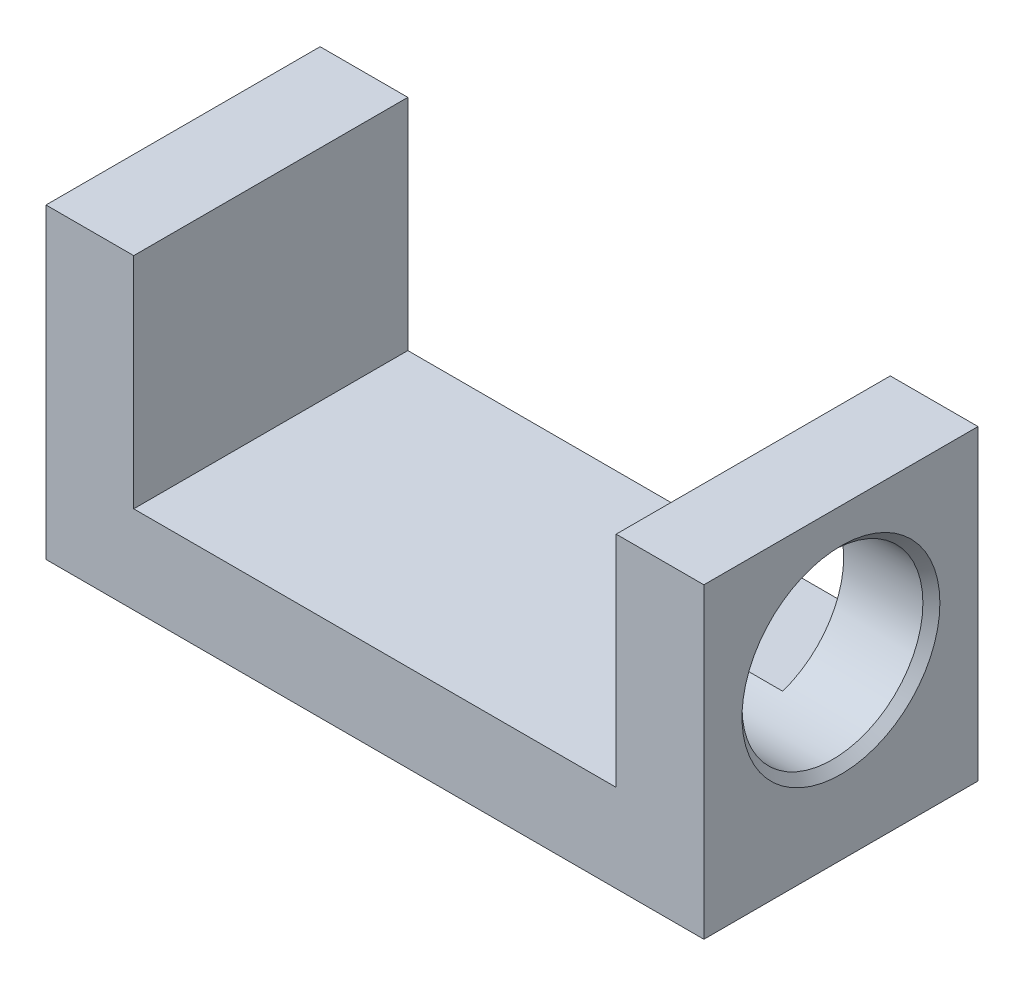
ISO-10303-21;
HEADER;
FILE_DESCRIPTION(('STEP AP214'),'2;1');
FILE_NAME('part.step','',(''),(''),'','','');
FILE_SCHEMA(('AUTOMOTIVE_DESIGN { 1 0 10303 214 1 1 1 1 }'));
ENDSEC;
DATA;
#1=APPLICATION_CONTEXT('core data for automotive mechanical design processes');
#2=APPLICATION_PROTOCOL_DEFINITION('international standard','automotive_design',2000,#1);
#3=PRODUCT_CONTEXT('',#1,'mechanical');
#4=PRODUCT('Part','Part','',(#3));
#5=PRODUCT_RELATED_PRODUCT_CATEGORY('part','',(#4));
#6=PRODUCT_DEFINITION_FORMATION('','',#4);
#7=PRODUCT_DEFINITION_CONTEXT('part definition',#1,'design');
#8=PRODUCT_DEFINITION('design','',#6,#7);
#9=PRODUCT_DEFINITION_SHAPE('','',#8);
#10=(LENGTH_UNIT() NAMED_UNIT(*) SI_UNIT(.MILLI.,.METRE.));
#11=(NAMED_UNIT(*) PLANE_ANGLE_UNIT() SI_UNIT($,.RADIAN.));
#12=(NAMED_UNIT(*) SI_UNIT($,.STERADIAN.) SOLID_ANGLE_UNIT());
#13=UNCERTAINTY_MEASURE_WITH_UNIT(LENGTH_MEASURE(1.E-05),#10,'distance_accuracy_value','');
#14=(GEOMETRIC_REPRESENTATION_CONTEXT(3) GLOBAL_UNCERTAINTY_ASSIGNED_CONTEXT((#13)) GLOBAL_UNIT_ASSIGNED_CONTEXT((#10,
#11,#12)) REPRESENTATION_CONTEXT('',''));
#15=CARTESIAN_POINT('',(0.,0.,0.));
#16=DIRECTION('',(0.,0.,1.));
#17=DIRECTION('',(1.,0.,0.));
#18=AXIS2_PLACEMENT_3D('',#15,#16,#17);
#19=CARTESIAN_POINT('',(-60.,12.2,12.5));
#20=DIRECTION('',(0.,-1.,0.));
#21=DIRECTION('',(0.,0.,-1.));
#22=AXIS2_PLACEMENT_3D('',#19,#20,#21);
#23=PLANE('',#22);
#24=DIRECTION('',(-1.,0.,0.));
#25=VECTOR('',#24,1.);
#26=CARTESIAN_POINT('',(-60.,12.2,12.5));
#27=LINE('',#26,#25);
#28=CARTESIAN_POINT('',(-52.,12.2,12.5));
#29=VERTEX_POINT('',#28);
#30=CARTESIAN_POINT('',(-60.,12.2,12.5));
#31=VERTEX_POINT('',#30);
#32=EDGE_CURVE('E180',#29,#31,#27,.T.);
#33=ORIENTED_EDGE('',*,*,#32,.F.);
#34=DIRECTION('',(0.,0.,1.));
#35=VECTOR('',#34,1.);
#36=CARTESIAN_POINT('',(-52.,12.2,-12.5));
#37=LINE('',#36,#35);
#38=CARTESIAN_POINT('',(-52.,12.2,-12.5));
#39=VERTEX_POINT('',#38);
#40=EDGE_CURVE('E181',#39,#29,#37,.T.);
#41=ORIENTED_EDGE('',*,*,#40,.F.);
#42=DIRECTION('',(-1.,0.,0.));
#43=VECTOR('',#42,1.);
#44=CARTESIAN_POINT('',(-60.,12.2,-12.5));
#45=LINE('',#44,#43);
#46=CARTESIAN_POINT('',(-60.,12.2,-12.5));
#47=VERTEX_POINT('',#46);
#48=EDGE_CURVE('E203',#39,#47,#45,.T.);
#49=ORIENTED_EDGE('',*,*,#48,.T.);
#50=DIRECTION('',(0.,0.,-1.));
#51=VECTOR('',#50,1.);
#52=CARTESIAN_POINT('',(-60.,12.2,12.5));
#53=LINE('',#52,#51);
#54=EDGE_CURVE('E184',#31,#47,#53,.T.);
#55=ORIENTED_EDGE('',*,*,#54,.F.);
#56=EDGE_LOOP('',(#33,#41,#49,#55));
#57=FACE_BOUND('',#56,.T.);
#58=ADVANCED_FACE('F41',(#57),#23,.F.);
#59=CARTESIAN_POINT('',(-60.,12.2,12.5));
#60=DIRECTION('',(1.,0.,0.));
#61=DIRECTION('',(0.,1.,0.));
#62=AXIS2_PLACEMENT_3D('',#59,#60,#61);
#63=PLANE('',#62);
#64=DIRECTION('',(0.,-1.,0.));
#65=VECTOR('',#64,1.);
#66=CARTESIAN_POINT('',(-60.,12.2,-12.5));
#67=LINE('',#66,#65);
#68=CARTESIAN_POINT('',(-60.,-15.8,-12.5));
#69=VERTEX_POINT('',#68);
#70=EDGE_CURVE('E196',#47,#69,#67,.T.);
#71=ORIENTED_EDGE('',*,*,#70,.T.);
#72=DIRECTION('',(0.,0.,-1.));
#73=VECTOR('',#72,1.);
#74=CARTESIAN_POINT('',(-60.,-15.8,12.5));
#75=LINE('',#74,#73);
#76=CARTESIAN_POINT('',(-60.,-15.8,12.5));
#77=VERTEX_POINT('',#76);
#78=EDGE_CURVE('E121',#77,#69,#75,.T.);
#79=ORIENTED_EDGE('',*,*,#78,.F.);
#80=DIRECTION('',(0.,-1.,0.));
#81=VECTOR('',#80,1.);
#82=CARTESIAN_POINT('',(-60.,12.2,12.5));
#83=LINE('',#82,#81);
#84=EDGE_CURVE('E207',#31,#77,#83,.T.);
#85=ORIENTED_EDGE('',*,*,#84,.F.);
#86=ORIENTED_EDGE('',*,*,#54,.T.);
#87=EDGE_LOOP('',(#71,#79,#85,#86));
#88=FACE_BOUND('',#87,.T.);
#89=ADVANCED_FACE('F43',(#88),#63,.F.);
#90=CARTESIAN_POINT('',(-60.,-15.8,12.5));
#91=DIRECTION('',(0.,1.,0.));
#92=DIRECTION('',(0.,0.,1.));
#93=AXIS2_PLACEMENT_3D('',#90,#91,#92);
#94=PLANE('',#93);
#95=DIRECTION('',(1.,0.,0.));
#96=VECTOR('',#95,1.);
#97=CARTESIAN_POINT('',(-60.,-15.8,-12.5));
#98=LINE('',#97,#96);
#99=CARTESIAN_POINT('',(0.,-15.8,-12.5));
#100=VERTEX_POINT('',#99);
#101=EDGE_CURVE('E199',#69,#100,#98,.T.);
#102=ORIENTED_EDGE('',*,*,#101,.T.);
#103=DIRECTION('',(0.,0.,-1.));
#104=VECTOR('',#103,1.);
#105=CARTESIAN_POINT('',(0.,-15.8,12.5));
#106=LINE('',#105,#104);
#107=CARTESIAN_POINT('',(0.,-15.8,12.5));
#108=VERTEX_POINT('',#107);
#109=EDGE_CURVE('E211',#108,#100,#106,.T.);
#110=ORIENTED_EDGE('',*,*,#109,.F.);
#111=DIRECTION('',(1.,0.,0.));
#112=VECTOR('',#111,1.);
#113=CARTESIAN_POINT('',(-60.,-15.8,12.5));
#114=LINE('',#113,#112);
#115=EDGE_CURVE('E192',#77,#108,#114,.T.);
#116=ORIENTED_EDGE('',*,*,#115,.F.);
#117=ORIENTED_EDGE('',*,*,#78,.T.);
#118=EDGE_LOOP('',(#102,#110,#116,#117));
#119=FACE_BOUND('',#118,.T.);
#120=ADVANCED_FACE('F165',(#119),#94,.F.);
#121=CARTESIAN_POINT('',(0.,12.2,12.5));
#122=DIRECTION('',(-1.,0.,0.));
#123=DIRECTION('',(0.,0.,1.));
#124=AXIS2_PLACEMENT_3D('',#121,#122,#123);
#125=PLANE('',#124);
#126=CARTESIAN_POINT('',(0.,0.,0.));
#127=DIRECTION('',(1.,0.,0.));
#128=DIRECTION('',(0.,0.,-1.));
#129=AXIS2_PLACEMENT_3D('',#126,#127,#128);
#130=CIRCLE('',#129,9.025);
#131=CARTESIAN_POINT('',(0.,0.,-9.025));
#132=VERTEX_POINT('',#131);
#133=EDGE_CURVE('E252',#132,#132,#130,.T.);
#134=ORIENTED_EDGE('',*,*,#133,.F.);
#135=EDGE_LOOP('',(#134));
#136=FACE_BOUND('',#135,.T.);
#137=DIRECTION('',(0.,1.,0.));
#138=VECTOR('',#137,1.);
#139=CARTESIAN_POINT('',(0.,12.2,-12.5));
#140=LINE('',#139,#138);
#141=CARTESIAN_POINT('',(0.,12.2,-12.5));
#142=VERTEX_POINT('',#141);
#143=EDGE_CURVE('E201',#100,#142,#140,.T.);
#144=ORIENTED_EDGE('',*,*,#143,.T.);
#145=DIRECTION('',(0.,0.,-1.));
#146=VECTOR('',#145,1.);
#147=CARTESIAN_POINT('',(0.,12.2,12.5));
#148=LINE('',#147,#146);
#149=CARTESIAN_POINT('',(0.,12.2,12.5));
#150=VERTEX_POINT('',#149);
#151=EDGE_CURVE('E209',#150,#142,#148,.T.);
#152=ORIENTED_EDGE('',*,*,#151,.F.);
#153=DIRECTION('',(0.,1.,0.));
#154=VECTOR('',#153,1.);
#155=CARTESIAN_POINT('',(0.,12.2,12.5));
#156=LINE('',#155,#154);
#157=EDGE_CURVE('E189',#108,#150,#156,.T.);
#158=ORIENTED_EDGE('',*,*,#157,.F.);
#159=ORIENTED_EDGE('',*,*,#109,.T.);
#160=EDGE_LOOP('',(#144,#152,#158,#159));
#161=FACE_BOUND('',#160,.T.);
#162=ADVANCED_FACE('F162',(#136,#161),#125,.F.);
#163=CARTESIAN_POINT('',(-8.,12.2,-12.5));
#164=VERTEX_POINT('',#163);
#165=EDGE_CURVE('E204',#142,#164,#45,.T.);
#166=ORIENTED_EDGE('',*,*,#165,.T.);
#167=DIRECTION('',(0.,0.,1.));
#168=VECTOR('',#167,1.);
#169=CARTESIAN_POINT('',(-8.,12.2,-12.5));
#170=LINE('',#169,#168);
#171=CARTESIAN_POINT('',(-8.,12.2,12.5));
#172=VERTEX_POINT('',#171);
#173=EDGE_CURVE('E225',#164,#172,#170,.T.);
#174=ORIENTED_EDGE('',*,*,#173,.T.);
#175=EDGE_CURVE('E188',#150,#172,#27,.T.);
#176=ORIENTED_EDGE('',*,*,#175,.F.);
#177=ORIENTED_EDGE('',*,*,#151,.T.);
#178=EDGE_LOOP('',(#166,#174,#176,#177));
#179=FACE_BOUND('',#178,.T.);
#180=ADVANCED_FACE('F155',(#179),#23,.F.);
#181=CARTESIAN_POINT('',(0.,0.,12.5));
#182=DIRECTION('',(0.,0.,1.));
#183=DIRECTION('',(1.,0.,0.));
#184=AXIS2_PLACEMENT_3D('',#181,#182,#183);
#185=PLANE('',#184);
#186=DIRECTION('',(0.,-1.,0.));
#187=VECTOR('',#186,1.);
#188=CARTESIAN_POINT('',(-52.,12.2,12.5));
#189=LINE('',#188,#187);
#190=CARTESIAN_POINT('',(-52.,-7.80000000000001,12.5));
#191=VERTEX_POINT('',#190);
#192=EDGE_CURVE('E246',#29,#191,#189,.T.);
#193=ORIENTED_EDGE('',*,*,#192,.F.);
#194=ORIENTED_EDGE('',*,*,#32,.T.);
#195=ORIENTED_EDGE('',*,*,#84,.T.);
#196=ORIENTED_EDGE('',*,*,#115,.T.);
#197=ORIENTED_EDGE('',*,*,#157,.T.);
#198=ORIENTED_EDGE('',*,*,#175,.T.);
#199=DIRECTION('',(0.,1.,0.));
#200=VECTOR('',#199,1.);
#201=CARTESIAN_POINT('',(-8.,-7.80000000000001,12.5));
#202=LINE('',#201,#200);
#203=CARTESIAN_POINT('',(-8.,-7.80000000000001,12.5));
#204=VERTEX_POINT('',#203);
#205=EDGE_CURVE('E228',#204,#172,#202,.T.);
#206=ORIENTED_EDGE('',*,*,#205,.F.);
#207=DIRECTION('',(1.,0.,0.));
#208=VECTOR('',#207,1.);
#209=CARTESIAN_POINT('',(-52.,-7.80000000000001,12.5));
#210=LINE('',#209,#208);
#211=EDGE_CURVE('E244',#191,#204,#210,.T.);
#212=ORIENTED_EDGE('',*,*,#211,.F.);
#213=EDGE_LOOP('',(#193,#194,#195,#196,#197,#198,#206,#212));
#214=FACE_BOUND('',#213,.T.);
#215=ADVANCED_FACE('F152',(#214),#185,.T.);
#216=CARTESIAN_POINT('',(0.,0.,-12.5));
#217=DIRECTION('',(0.,0.,1.));
#218=DIRECTION('',(1.,0.,0.));
#219=AXIS2_PLACEMENT_3D('',#216,#217,#218);
#220=PLANE('',#219);
#221=ORIENTED_EDGE('',*,*,#48,.F.);
#222=DIRECTION('',(0.,-1.,0.));
#223=VECTOR('',#222,1.);
#224=CARTESIAN_POINT('',(-52.,12.2,-12.5));
#225=LINE('',#224,#223);
#226=CARTESIAN_POINT('',(-52.,-7.80000000000001,-12.5));
#227=VERTEX_POINT('',#226);
#228=EDGE_CURVE('E241',#39,#227,#225,.T.);
#229=ORIENTED_EDGE('',*,*,#228,.T.);
#230=DIRECTION('',(1.,0.,0.));
#231=VECTOR('',#230,1.);
#232=CARTESIAN_POINT('',(-52.,-7.80000000000001,-12.5));
#233=LINE('',#232,#231);
#234=CARTESIAN_POINT('',(-8.,-7.80000000000001,-12.5));
#235=VERTEX_POINT('',#234);
#236=EDGE_CURVE('E238',#227,#235,#233,.T.);
#237=ORIENTED_EDGE('',*,*,#236,.T.);
#238=DIRECTION('',(0.,1.,0.));
#239=VECTOR('',#238,1.);
#240=CARTESIAN_POINT('',(-8.,-7.80000000000001,-12.5));
#241=LINE('',#240,#239);
#242=EDGE_CURVE('E63',#235,#164,#241,.T.);
#243=ORIENTED_EDGE('',*,*,#242,.T.);
#244=ORIENTED_EDGE('',*,*,#165,.F.);
#245=ORIENTED_EDGE('',*,*,#143,.F.);
#246=ORIENTED_EDGE('',*,*,#101,.F.);
#247=ORIENTED_EDGE('',*,*,#70,.F.);
#248=EDGE_LOOP('',(#221,#229,#237,#243,#244,#245,#246,#247));
#249=FACE_BOUND('',#248,.T.);
#250=ADVANCED_FACE('F150',(#249),#220,.F.);
#251=CARTESIAN_POINT('',(-52.,12.2,-12.5));
#252=DIRECTION('',(-1.,0.,0.));
#253=DIRECTION('',(0.,0.,1.));
#254=AXIS2_PLACEMENT_3D('',#251,#252,#253);
#255=PLANE('',#254);
#256=DIRECTION('',(0.,0.,1.));
#257=VECTOR('',#256,1.);
#258=CARTESIAN_POINT('',(-52.,-7.80000000000001,-12.5));
#259=LINE('',#258,#257);
#260=EDGE_CURVE('E231',#227,#191,#259,.T.);
#261=ORIENTED_EDGE('',*,*,#260,.F.);
#262=ORIENTED_EDGE('',*,*,#228,.F.);
#263=ORIENTED_EDGE('',*,*,#40,.T.);
#264=ORIENTED_EDGE('',*,*,#192,.T.);
#265=EDGE_LOOP('',(#261,#262,#263,#264));
#266=FACE_BOUND('',#265,.T.);
#267=ADVANCED_FACE('F147',(#266),#255,.F.);
#268=CARTESIAN_POINT('',(-8.,-7.80000000000001,-12.5));
#269=DIRECTION('',(1.,0.,0.));
#270=DIRECTION('',(0.,0.,-1.));
#271=AXIS2_PLACEMENT_3D('',#268,#269,#270);
#272=PLANE('',#271);
#273=DIRECTION('',(0.,0.,1.));
#274=VECTOR('',#273,1.);
#275=CARTESIAN_POINT('',(-8.,-7.80000000000001,-12.5));
#276=LINE('',#275,#274);
#277=CARTESIAN_POINT('',(-8.,-7.80000000000001,-2.68747093007529));
#278=VERTEX_POINT('',#277);
#279=EDGE_CURVE('E233',#235,#278,#276,.T.);
#280=ORIENTED_EDGE('',*,*,#279,.T.);
#281=CARTESIAN_POINT('',(-8.,0.,0.));
#282=DIRECTION('',(1.,0.,0.));
#283=DIRECTION('',(0.,0.,-1.));
#284=AXIS2_PLACEMENT_3D('',#281,#282,#283);
#285=CIRCLE('',#284,8.24999999999999);
#286=CARTESIAN_POINT('',(-8.,-7.80000000000001,2.68747093007529));
#287=VERTEX_POINT('',#286);
#288=EDGE_CURVE('E126',#278,#287,#285,.T.);
#289=ORIENTED_EDGE('',*,*,#288,.T.);
#290=EDGE_CURVE('E132',#287,#204,#276,.T.);
#291=ORIENTED_EDGE('',*,*,#290,.T.);
#292=ORIENTED_EDGE('',*,*,#205,.T.);
#293=ORIENTED_EDGE('',*,*,#173,.F.);
#294=ORIENTED_EDGE('',*,*,#242,.F.);
#295=EDGE_LOOP('',(#280,#289,#291,#292,#293,#294));
#296=FACE_BOUND('',#295,.T.);
#297=ADVANCED_FACE('F146',(#296),#272,.F.);
#298=CARTESIAN_POINT('',(-52.,-7.80000000000001,-12.5));
#299=DIRECTION('',(0.,-1.,0.));
#300=DIRECTION('',(0.,0.,-1.));
#301=AXIS2_PLACEMENT_3D('',#298,#299,#300);
#302=PLANE('',#301);
#303=CARTESIAN_POINT('',(6.24067815196975,-7.80000000000001,-39.5092796826334));
#304=CARTESIAN_POINT('',(5.86700967213537,-7.80000000000001,-38.875382827097));
#305=CARTESIAN_POINT('',(5.49358717051787,-7.80000000000001,-38.2413409244897));
#306=CARTESIAN_POINT('',(4.74732097065002,-7.80000000000001,-36.9729143772007));
#307=CARTESIAN_POINT('',(4.37447727391189,-7.80000000000001,-36.3385297316293));
#308=CARTESIAN_POINT('',(3.25588584792664,-7.80000000000001,-34.4329789724066));
#309=CARTESIAN_POINT('',(2.51114332773266,-7.80000000000001,-33.1612224964408));
#310=CARTESIAN_POINT('',(1.00173925983983,-7.80000000000001,-30.5751149579655));
#311=CARTESIAN_POINT('',(0.237196648997117,-7.80000000000001,-29.2606943904307));
#312=CARTESIAN_POINT('',(-0.904751802498589,-7.80000000000001,-27.2875077531212));
#313=CARTESIAN_POINT('',(-1.28431923152097,-7.80000000000001,-26.6299928508842));
#314=CARTESIAN_POINT('',(-2.04167025362121,-7.80000000000001,-25.3139366926847));
#315=CARTESIAN_POINT('',(-2.41945384794487,-7.80000000000001,-24.6553954374394));
#316=CARTESIAN_POINT('',(-3.28832715781302,-7.80000000000001,-23.1348787747736));
#317=CARTESIAN_POINT('',(-3.77863231027412,-7.80000000000001,-22.2724546708384));
#318=CARTESIAN_POINT('',(-4.75412294252243,-7.80000000000001,-20.5445894145353));
#319=CARTESIAN_POINT('',(-5.2393078787028,-7.80000000000001,-19.6791479545404));
#320=CARTESIAN_POINT('',(-5.9627284192289,-7.80000000000001,-18.3757589094117));
#321=CARTESIAN_POINT('',(-6.20372906060428,-7.80000000000001,-17.9393462357389));
#322=CARTESIAN_POINT('',(-6.68344842580865,-7.80000000000001,-17.0652691721215));
#323=CARTESIAN_POINT('',(-6.9221671569676,-7.80000000000001,-16.6276047862035));
#324=CARTESIAN_POINT('',(-7.39672041308063,-7.80000000000001,-15.7509266504394));
#325=CARTESIAN_POINT('',(-7.63255598993818,-7.80000000000001,-15.3119134705687));
#326=CARTESIAN_POINT('',(-8.10075266425303,-7.80000000000001,-14.432037829775));
#327=CARTESIAN_POINT('',(-8.33311377540408,-7.80000000000001,-13.9911753761493));
#328=CARTESIAN_POINT('',(-8.78820064428738,-7.80000000000001,-13.1172480848858));
#329=CARTESIAN_POINT('',(-9.0110252826996,-7.80000000000001,-12.6842348283138));
#330=CARTESIAN_POINT('',(-9.45134033901454,-7.80000000000001,-11.8154866964165));
#331=CARTESIAN_POINT('',(-9.66883064695639,-7.80000000000001,-11.379751765219));
#332=CARTESIAN_POINT('',(-10.097242482047,-7.80000000000001,-10.5041565254599));
#333=CARTESIAN_POINT('',(-10.3081525072684,-7.80000000000001,-10.0642905700579));
#334=CARTESIAN_POINT('',(-10.7207847829527,-7.80000000000001,-9.1802750216606));
#335=CARTESIAN_POINT('',(-10.922507498618,-7.80000000000001,-8.73612564694055));
#336=CARTESIAN_POINT('',(-11.3118454409738,-7.80000000000001,-7.84640593624235));
#337=CARTESIAN_POINT('',(-11.499571224706,-7.80000000000001,-7.40088430139528));
#338=CARTESIAN_POINT('',(-11.8585331527458,-7.80000000000001,-6.50301630133615));
#339=CARTESIAN_POINT('',(-12.0297644792746,-7.80000000000001,-6.05066798651113));
#340=CARTESIAN_POINT('',(-12.3489349521039,-7.80000000000001,-5.13926582448756));
#341=CARTESIAN_POINT('',(-12.4969427694424,-7.80000000000001,-4.68023630711458));
#342=CARTESIAN_POINT('',(-12.7617517930388,-7.80000000000001,-3.753358136757));
#343=CARTESIAN_POINT('',(-12.8785804071266,-7.80000000000001,-3.28551761894736));
#344=CARTESIAN_POINT('',(-12.9939049572165,-7.80000000000001,-2.71988128284871));
#345=CARTESIAN_POINT('',(-13.0121948227624,-7.80000000000001,-2.62602953677828));
#346=CARTESIAN_POINT('',(-13.0470783910835,-7.80000000000001,-2.4379978997806));
#347=CARTESIAN_POINT('',(-13.063671877047,-7.80000000000001,-2.3438179684952));
#348=CARTESIAN_POINT('',(-13.1108011185289,-7.80000000000001,-2.06075451922899));
#349=CARTESIAN_POINT('',(-13.1386710763199,-7.80000000000001,-1.87141831498651));
#350=CARTESIAN_POINT('',(-13.1867363891276,-7.80000000000001,-1.49184215750115));
#351=CARTESIAN_POINT('',(-13.2069345260546,-7.80000000000001,-1.30160255722727));
#352=CARTESIAN_POINT('',(-13.2392293266118,-7.80000000000001,-0.920446776719946));
#353=CARTESIAN_POINT('',(-13.2513266704803,-7.80000000000001,-0.729530654649038));
#354=CARTESIAN_POINT('',(-13.266979050314,-7.80000000000001,-0.351265172583419));
#355=CARTESIAN_POINT('',(-13.2707040097422,-7.80000000000001,-0.163922868286082));
#356=CARTESIAN_POINT('',(-13.2700283260803,-7.80000000000001,0.210745597825126));
#357=CARTESIAN_POINT('',(-13.2656277447039,-7.80000000000001,0.398071759750794));
#358=CARTESIAN_POINT('',(-13.2487961152232,-7.80000000000001,0.772482352341575));
#359=CARTESIAN_POINT('',(-13.2363598969115,-7.80000000000001,0.959566549616066));
#360=CARTESIAN_POINT('',(-13.2037307093243,-7.80000000000001,1.33306184066774));
#361=CARTESIAN_POINT('',(-13.183537192012,-7.80000000000001,1.51947288594874));
#362=CARTESIAN_POINT('',(-13.1241700763309,-7.80000000000001,1.98201281660108));
#363=CARTESIAN_POINT('',(-13.0805428134478,-7.80000000000001,2.25757617831337));
#364=CARTESIAN_POINT('',(-12.9788107485984,-7.80000000000001,2.80601814656091));
#365=CARTESIAN_POINT('',(-12.9207035452816,-7.80000000000001,3.07889629997135));
#366=CARTESIAN_POINT('',(-12.7919721228921,-7.80000000000001,3.62176541811793));
#367=CARTESIAN_POINT('',(-12.7213432323278,-7.80000000000001,3.89175526530869));
#368=CARTESIAN_POINT('',(-12.5694995745823,-7.80000000000001,4.42874572646431));
#369=CARTESIAN_POINT('',(-12.488283719185,-7.80000000000001,4.69574603007123));
#370=CARTESIAN_POINT('',(-12.314548511235,-7.80000000000001,5.23449587797559));
#371=CARTESIAN_POINT('',(-12.2217717036344,-7.80000000000001,5.50616189333898));
#372=CARTESIAN_POINT('',(-12.0284736846213,-7.80000000000001,6.04671121629353));
#373=CARTESIAN_POINT('',(-11.9279524012156,-7.80000000000001,6.31559449798981));
#374=CARTESIAN_POINT('',(-11.7205336813917,-7.80000000000001,6.85080592193972));
#375=CARTESIAN_POINT('',(-11.6136378173607,-7.80000000000001,7.11713467564517));
#376=CARTESIAN_POINT('',(-11.4493184584983,-7.80000000000001,7.51497034770065));
#377=CARTESIAN_POINT('',(-11.3938835756194,-7.80000000000001,7.64730409324749));
#378=CARTESIAN_POINT('',(-11.2818008847741,-7.80000000000001,7.91145641383129));
#379=CARTESIAN_POINT('',(-11.2251530815834,-7.80000000000001,8.04327499089431));
#380=CARTESIAN_POINT('',(-11.0170136258194,-7.80000000000001,8.52207025031644));
#381=CARTESIAN_POINT('',(-10.8622322018627,-7.80000000000001,8.86761960214947));
#382=CARTESIAN_POINT('',(-10.5465961829916,-7.80000000000001,9.55593948549743));
#383=CARTESIAN_POINT('',(-10.385741274734,-7.80000000000001,9.89870987252874));
#384=CARTESIAN_POINT('',(-10.059140013465,-7.80000000000001,10.5819867028883));
#385=CARTESIAN_POINT('',(-9.89339275197896,-7.80000000000001,10.9224927111701));
#386=CARTESIAN_POINT('',(-9.55796607631193,-7.80000000000001,11.6015511165355));
#387=CARTESIAN_POINT('',(-9.38828672770427,-7.80000000000001,11.9401035460805));
#388=CARTESIAN_POINT('',(-9.04560774895421,-7.80000000000001,12.6157737076116));
#389=CARTESIAN_POINT('',(-8.87260621211039,-7.80000000000001,12.9528904712761));
#390=CARTESIAN_POINT('',(-8.52393431439341,-7.80000000000001,13.6257420552002));
#391=CARTESIAN_POINT('',(-8.34826393401985,-7.80000000000001,13.9614768653396));
#392=CARTESIAN_POINT('',(-7.81792897129882,-7.80000000000001,14.9669449521481));
#393=CARTESIAN_POINT('',(-7.45994707420206,-7.80000000000001,15.6349291441788));
#394=CARTESIAN_POINT('',(-6.91787867400323,-7.80000000000001,16.6350145052388));
#395=CARTESIAN_POINT('',(-6.73615137303034,-7.80000000000001,16.9684013133128));
#396=CARTESIAN_POINT('',(-6.37132962040025,-7.80000000000001,17.6344199500314));
#397=CARTESIAN_POINT('',(-6.18823519008877,-7.80000000000001,17.9670517903585));
#398=CARTESIAN_POINT('',(-5.63718599374532,-7.80000000000001,18.9639944797193));
#399=CARTESIAN_POINT('',(-5.26747511713259,-7.80000000000001,19.6273344778917));
#400=CARTESIAN_POINT('',(-4.52466260235232,-7.80000000000001,20.9517802862328));
#401=CARTESIAN_POINT('',(-4.15156229973856,-7.80000000000001,21.6128868466254));
#402=CARTESIAN_POINT('',(-3.40262313187404,-7.80000000000001,22.9335465136307));
#403=CARTESIAN_POINT('',(-3.02678426471885,-7.80000000000001,23.5930996191627));
#404=CARTESIAN_POINT('',(-2.02074487115792,-7.80000000000001,25.3519143444019));
#405=CARTESIAN_POINT('',(-1.38862741848528,-7.80000000000001,26.4500790801312));
#406=CARTESIAN_POINT('',(-0.12016898340926,-7.80000000000001,28.6441255119315));
#407=CARTESIAN_POINT('',(0.516172459317419,-7.80000000000001,29.7400069414878));
#408=CARTESIAN_POINT('',(1.78956804591789,-7.80000000000001,31.9260455479285));
#409=CARTESIAN_POINT('',(2.42661127294193,-7.80000000000001,33.0162090865701));
#410=CARTESIAN_POINT('',(3.38382286385741,-7.80000000000001,34.6504027023654));
#411=CARTESIAN_POINT('',(3.70314895315722,-7.80000000000001,35.1949265117125));
#412=CARTESIAN_POINT('',(4.34229570832461,-7.80000000000001,36.2836834150631));
#413=CARTESIAN_POINT('',(4.6621163739277,-7.80000000000001,36.8279165092218));
#414=CARTESIAN_POINT('',(4.98215111690147,-7.80000000000001,37.3720237047844));
#415=B_SPLINE_CURVE_WITH_KNOTS('',3,(#303,#304,#305,#306,#307,#308,#309,#310,#311,#312,#313,
#314,#315,#316,#317,#318,#319,#320,#321,#322,#323,#324,#325,#326,#327,#328,#329,#330,#331,#332,
#333,#334,#335,#336,#337,#338,#339,#340,#341,#342,#343,#344,#345,#346,#347,#348,#349,#350,#351,
#352,#353,#354,#355,#356,#357,#358,#359,#360,#361,#362,#363,#364,#365,#366,#367,#368,#369,#370,
#371,#372,#373,#374,#375,#376,#377,#378,#379,#380,#381,#382,#383,#384,#385,#386,#387,#388,#389,
#390,#391,#392,#393,#394,#395,#396,#397,#398,#399,#400,#401,#402,#403,#404,#405,#406,#407,#408,
#409,#410,#411,#412,#413,#414),.UNSPECIFIED.,.F.,.F.,(4,2,2,2,2,2,2,2,2,2,2,2,2,2,2,2,2,2,2,2,2,
2,2,2,2,2,2,2,2,2,2,2,2,2,2,2,2,2,2,2,2,2,2,2,2,2,2,2,2,2,2,2,2,2,2,4),(0.,2.20750540379127,
4.41501656537252,8.83633078890234,13.3981216578753,15.6757444686171,17.9533656884559,
20.9295213778657,23.9059899258156,25.4015902539014,26.8971857761999,28.3922182959533,
29.8872449218479,31.3481620192194,32.80910920639,34.2724812523049,35.7357791173474,
37.1859171919589,38.6364775535295,40.0826643683537,41.5275757053909,41.8144168587015,
42.1012946270214,42.6752673832807,43.2490318097722,43.8227480501883,44.3847109464562,
44.9466695746153,45.5089901329688,46.0713504253825,46.9078688192836,47.7445260336674,
48.5814960408472,49.418552146699,50.2796243741288,51.1407046071182,52.0015733131553,
52.4319952153364,52.8624154230558,53.998223818849,55.1340908935683,56.2701702342549,
57.4062306427766,58.5429638034734,59.679705273928,61.9532311302449,63.0923276784233,
64.2314064783174,66.5096256044029,68.7869829304542,71.064341840361,74.8656222064212,
78.6673238627902,82.4552647893522,84.3490116783527,86.2427575549544),.UNSPECIFIED.);
#416=CARTESIAN_POINT('',(-13.,-7.80000000000001,2.68747093007529));
#417=VERTEX_POINT('',#416);
#418=CARTESIAN_POINT('',(-13.,-7.80000000000001,-2.68747093007529));
#419=VERTEX_POINT('',#418);
#420=EDGE_CURVE('E117',#417,#419,#415,.F.);
#421=ORIENTED_EDGE('',*,*,#420,.T.);
#422=DIRECTION('',(1.,0.,0.));
#423=VECTOR('',#422,1.);
#424=CARTESIAN_POINT('',(0.,-7.80000000000001,-2.68747093007529));
#425=LINE('',#424,#423);
#426=EDGE_CURVE('E11',#419,#278,#425,.T.);
#427=ORIENTED_EDGE('',*,*,#426,.T.);
#428=ORIENTED_EDGE('',*,*,#279,.F.);
#429=ORIENTED_EDGE('',*,*,#236,.F.);
#430=ORIENTED_EDGE('',*,*,#260,.T.);
#431=ORIENTED_EDGE('',*,*,#211,.T.);
#432=ORIENTED_EDGE('',*,*,#290,.F.);
#433=DIRECTION('',(1.,0.,0.));
#434=VECTOR('',#433,1.);
#435=CARTESIAN_POINT('',(0.,-7.80000000000001,2.68747093007529));
#436=LINE('',#435,#434);
#437=EDGE_CURVE('E49',#287,#417,#436,.F.);
#438=ORIENTED_EDGE('',*,*,#437,.T.);
#439=EDGE_LOOP('',(#421,#427,#428,#429,#430,#431,#432,#438));
#440=FACE_BOUND('',#439,.T.);
#441=ADVANCED_FACE('F130',(#440),#302,.F.);
#442=CARTESIAN_POINT('',(0.,0.,0.));
#443=DIRECTION('',(1.,0.,0.));
#444=DIRECTION('',(0.,0.,-1.));
#445=AXIS2_PLACEMENT_3D('',#442,#443,#444);
#446=CYLINDRICAL_SURFACE('',#445,8.24999999999999);
#447=CARTESIAN_POINT('',(-0.775000000000012,0.,0.));
#448=DIRECTION('',(1.,0.,0.));
#449=DIRECTION('',(0.,0.,-1.));
#450=AXIS2_PLACEMENT_3D('',#447,#448,#449);
#451=CIRCLE('',#450,8.24999999999999);
#452=CARTESIAN_POINT('',(-0.775000000000012,0.,-8.24999999999999));
#453=VERTEX_POINT('',#452);
#454=EDGE_CURVE('E127',#453,#453,#451,.T.);
#455=ORIENTED_EDGE('',*,*,#454,.T.);
#456=EDGE_LOOP('',(#455));
#457=FACE_BOUND('',#456,.T.);
#458=CARTESIAN_POINT('',(-13.,0.,0.));
#459=DIRECTION('',(1.,0.,0.));
#460=DIRECTION('',(0.,0.,-1.));
#461=AXIS2_PLACEMENT_3D('',#458,#459,#460);
#462=CIRCLE('',#461,8.24999999999999);
#463=EDGE_CURVE('E55',#417,#419,#462,.T.);
#464=ORIENTED_EDGE('',*,*,#463,.F.);
#465=ORIENTED_EDGE('',*,*,#437,.F.);
#466=ORIENTED_EDGE('',*,*,#288,.F.);
#467=ORIENTED_EDGE('',*,*,#426,.F.);
#468=EDGE_LOOP('',(#464,#465,#466,#467));
#469=FACE_BOUND('',#468,.T.);
#470=ADVANCED_FACE('F124',(#457,#469),#446,.F.);
#471=CARTESIAN_POINT('',(-13.,0.,0.));
#472=DIRECTION('',(1.,0.,0.));
#473=DIRECTION('',(0.,0.,-1.));
#474=AXIS2_PLACEMENT_3D('',#471,#472,#473);
#475=CONICAL_SURFACE('',#474,8.24999999999999,1.02974425867665);
#476=ORIENTED_EDGE('',*,*,#463,.T.);
#477=ORIENTED_EDGE('',*,*,#420,.F.);
#478=EDGE_LOOP('',(#476,#477));
#479=FACE_BOUND('',#478,.T.);
#480=ADVANCED_FACE('F118',(#479),#475,.F.);
#481=CARTESIAN_POINT('',(0.,0.,0.));
#482=DIRECTION('',(1.,0.,0.));
#483=DIRECTION('',(0.,0.,-1.));
#484=AXIS2_PLACEMENT_3D('',#481,#482,#483);
#485=CONICAL_SURFACE('',#484,9.025,0.785398163397445);
#486=ORIENTED_EDGE('',*,*,#454,.F.);
#487=EDGE_LOOP('',(#486));
#488=FACE_BOUND('',#487,.T.);
#489=ORIENTED_EDGE('',*,*,#133,.T.);
#490=EDGE_LOOP('',(#489));
#491=FACE_BOUND('',#490,.T.);
#492=ADVANCED_FACE('F256',(#488,#491),#485,.F.);
#493=CLOSED_SHELL('',(#58,#89,#120,#162,#180,#215,#250,#267,#297,#441,#470,#480,#492));
#494=MANIFOLD_SOLID_BREP('B2',#493);
#495=ADVANCED_BREP_SHAPE_REPRESENTATION('',(#18,#494),#14);
#496=SHAPE_DEFINITION_REPRESENTATION(#9,#495);
ENDSEC;
END-ISO-10303-21;
